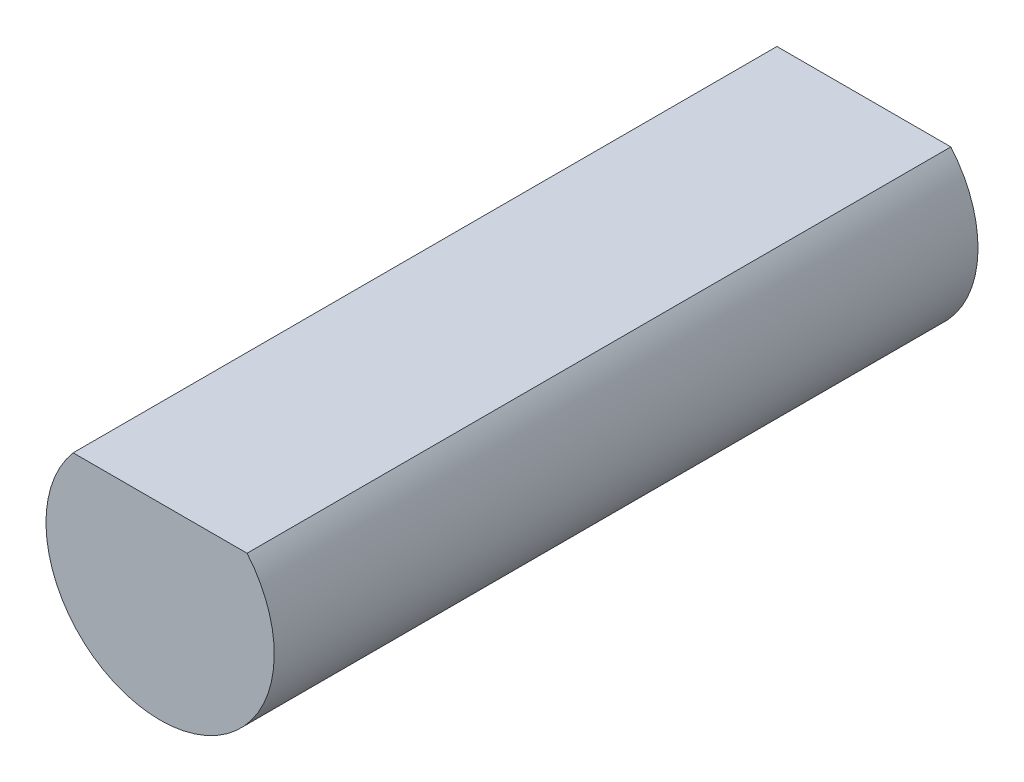
ISO-10303-21;
HEADER;
FILE_DESCRIPTION(('STEP AP214'),'2;1');
FILE_NAME('part.step','',(''),(''),'','','');
FILE_SCHEMA(('AUTOMOTIVE_DESIGN { 1 0 10303 214 1 1 1 1 }'));
ENDSEC;
DATA;
#1=APPLICATION_CONTEXT('core data for automotive mechanical design processes');
#2=APPLICATION_PROTOCOL_DEFINITION('international standard','automotive_design',2000,#1);
#3=PRODUCT_CONTEXT('',#1,'mechanical');
#4=PRODUCT('Part','Part','',(#3));
#5=PRODUCT_RELATED_PRODUCT_CATEGORY('part','',(#4));
#6=PRODUCT_DEFINITION_FORMATION('','',#4);
#7=PRODUCT_DEFINITION_CONTEXT('part definition',#1,'design');
#8=PRODUCT_DEFINITION('design','',#6,#7);
#9=PRODUCT_DEFINITION_SHAPE('','',#8);
#10=(LENGTH_UNIT() NAMED_UNIT(*) SI_UNIT(.MILLI.,.METRE.));
#11=(NAMED_UNIT(*) PLANE_ANGLE_UNIT() SI_UNIT($,.RADIAN.));
#12=(NAMED_UNIT(*) SI_UNIT($,.STERADIAN.) SOLID_ANGLE_UNIT());
#13=UNCERTAINTY_MEASURE_WITH_UNIT(LENGTH_MEASURE(1.E-05),#10,'distance_accuracy_value','');
#14=(GEOMETRIC_REPRESENTATION_CONTEXT(3) GLOBAL_UNCERTAINTY_ASSIGNED_CONTEXT((#13)) GLOBAL_UNIT_ASSIGNED_CONTEXT((#10,
#11,#12)) REPRESENTATION_CONTEXT('',''));
#15=CARTESIAN_POINT('',(0.,0.,0.));
#16=DIRECTION('',(0.,0.,1.));
#17=DIRECTION('',(1.,0.,0.));
#18=AXIS2_PLACEMENT_3D('',#15,#16,#17);
#19=CARTESIAN_POINT('',(0.,0.971365533668969,18.85));
#20=DIRECTION('',(0.,1.,0.));
#21=DIRECTION('',(0.,0.,1.));
#22=AXIS2_PLACEMENT_3D('',#19,#20,#21);
#23=PLANE('',#22);
#24=DIRECTION('',(1.,0.,0.));
#25=VECTOR('',#24,1.);
#26=CARTESIAN_POINT('',(0.,0.971365533668969,9.6));
#27=LINE('',#26,#25);
#28=CARTESIAN_POINT('',(-1.143,0.971365533668969,9.6));
#29=VERTEX_POINT('',#28);
#30=CARTESIAN_POINT('',(1.143,0.971365533668969,9.6));
#31=VERTEX_POINT('',#30);
#32=EDGE_CURVE('E62',#29,#31,#27,.T.);
#33=ORIENTED_EDGE('',*,*,#32,.F.);
#34=DIRECTION('',(0.,0.,-1.));
#35=VECTOR('',#34,1.);
#36=CARTESIAN_POINT('',(-1.143,0.971365533668969,18.85));
#37=LINE('',#36,#35);
#38=CARTESIAN_POINT('',(-1.143,0.971365533668969,18.85));
#39=VERTEX_POINT('',#38);
#40=EDGE_CURVE('E11',#39,#29,#37,.T.);
#41=ORIENTED_EDGE('',*,*,#40,.F.);
#42=DIRECTION('',(1.,0.,0.));
#43=VECTOR('',#42,1.);
#44=CARTESIAN_POINT('',(0.,0.971365533668969,18.85));
#45=LINE('',#44,#43);
#46=CARTESIAN_POINT('',(1.143,0.971365533668969,18.85));
#47=VERTEX_POINT('',#46);
#48=EDGE_CURVE('E63',#39,#47,#45,.T.);
#49=ORIENTED_EDGE('',*,*,#48,.T.);
#50=DIRECTION('',(0.,0.,-1.));
#51=VECTOR('',#50,1.);
#52=CARTESIAN_POINT('',(1.143,0.971365533668969,18.85));
#53=LINE('',#52,#51);
#54=EDGE_CURVE('E42',#47,#31,#53,.T.);
#55=ORIENTED_EDGE('',*,*,#54,.T.);
#56=EDGE_LOOP('',(#33,#41,#49,#55));
#57=FACE_BOUND('',#56,.T.);
#58=ADVANCED_FACE('F34',(#57),#23,.T.);
#59=CARTESIAN_POINT('',(0.,0.,18.85));
#60=DIRECTION('',(0.,0.,-1.));
#61=DIRECTION('',(-1.,0.,0.));
#62=AXIS2_PLACEMENT_3D('',#59,#60,#61);
#63=CYLINDRICAL_SURFACE('',#62,1.5);
#64=CARTESIAN_POINT('',(0.,0.,9.6));
#65=DIRECTION('',(0.,0.,1.));
#66=DIRECTION('',(1.,0.,0.));
#67=AXIS2_PLACEMENT_3D('',#64,#65,#66);
#68=CIRCLE('',#67,1.5);
#69=EDGE_CURVE('E64',#29,#31,#68,.T.);
#70=ORIENTED_EDGE('',*,*,#69,.T.);
#71=ORIENTED_EDGE('',*,*,#54,.F.);
#72=CARTESIAN_POINT('',(0.,0.,18.85));
#73=DIRECTION('',(0.,0.,1.));
#74=DIRECTION('',(1.,0.,0.));
#75=AXIS2_PLACEMENT_3D('',#72,#73,#74);
#76=CIRCLE('',#75,1.5);
#77=EDGE_CURVE('E49',#39,#47,#76,.T.);
#78=ORIENTED_EDGE('',*,*,#77,.F.);
#79=ORIENTED_EDGE('',*,*,#40,.T.);
#80=EDGE_LOOP('',(#70,#71,#78,#79));
#81=FACE_BOUND('',#80,.T.);
#82=ADVANCED_FACE('F65',(#81),#63,.T.);
#83=CARTESIAN_POINT('',(0.,0.,18.85));
#84=DIRECTION('',(0.,0.,1.));
#85=DIRECTION('',(1.,0.,0.));
#86=AXIS2_PLACEMENT_3D('',#83,#84,#85);
#87=PLANE('',#86);
#88=ORIENTED_EDGE('',*,*,#48,.F.);
#89=ORIENTED_EDGE('',*,*,#77,.T.);
#90=EDGE_LOOP('',(#88,#89));
#91=FACE_BOUND('',#90,.T.);
#92=ADVANCED_FACE('F73',(#91),#87,.T.);
#93=CARTESIAN_POINT('',(0.,0.,9.6));
#94=DIRECTION('',(0.,0.,1.));
#95=DIRECTION('',(1.,0.,0.));
#96=AXIS2_PLACEMENT_3D('',#93,#94,#95);
#97=PLANE('',#96);
#98=ORIENTED_EDGE('',*,*,#32,.T.);
#99=ORIENTED_EDGE('',*,*,#69,.F.);
#100=EDGE_LOOP('',(#98,#99));
#101=FACE_BOUND('',#100,.T.);
#102=ADVANCED_FACE('F68',(#101),#97,.F.);
#103=CLOSED_SHELL('',(#58,#82,#92,#102));
#104=MANIFOLD_SOLID_BREP('B2',#103);
#105=ADVANCED_BREP_SHAPE_REPRESENTATION('',(#18,#104),#14);
#106=SHAPE_DEFINITION_REPRESENTATION(#9,#105);
ENDSEC;
END-ISO-10303-21;
